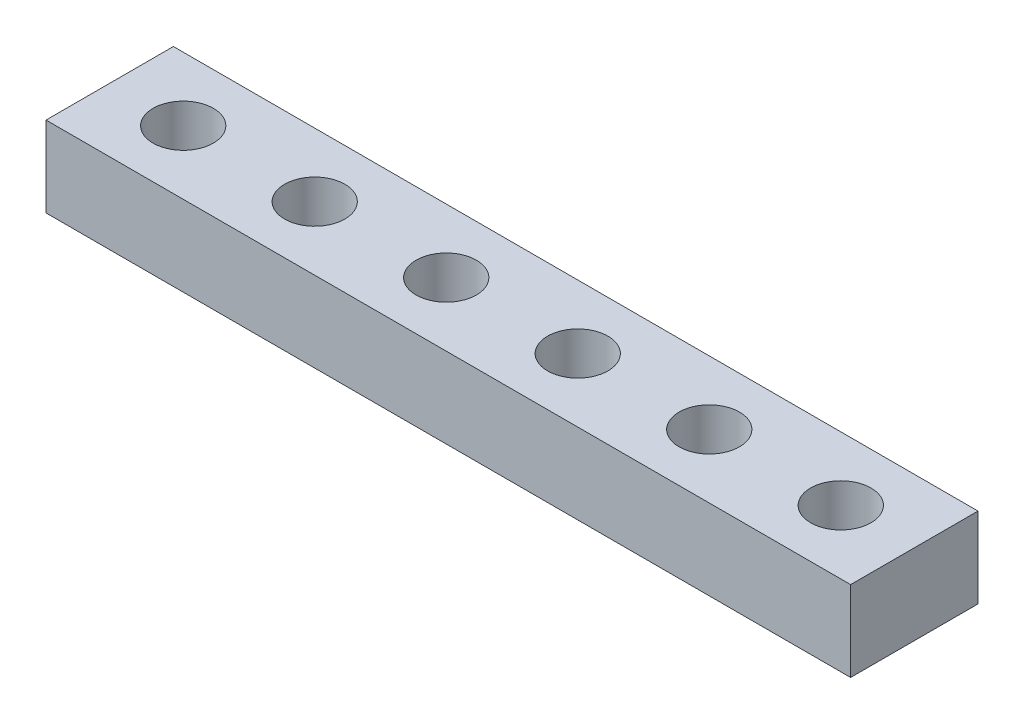
ISO-10303-21;
HEADER;
FILE_DESCRIPTION(('STEP AP214'),'2;1');
FILE_NAME('part.step','',(''),(''),'','','');
FILE_SCHEMA(('AUTOMOTIVE_DESIGN { 1 0 10303 214 1 1 1 1 }'));
ENDSEC;
DATA;
#1=APPLICATION_CONTEXT('core data for automotive mechanical design processes');
#2=APPLICATION_PROTOCOL_DEFINITION('international standard','automotive_design',2000,#1);
#3=PRODUCT_CONTEXT('',#1,'mechanical');
#4=PRODUCT('Part','Part','',(#3));
#5=PRODUCT_RELATED_PRODUCT_CATEGORY('part','',(#4));
#6=PRODUCT_DEFINITION_FORMATION('','',#4);
#7=PRODUCT_DEFINITION_CONTEXT('part definition',#1,'design');
#8=PRODUCT_DEFINITION('design','',#6,#7);
#9=PRODUCT_DEFINITION_SHAPE('','',#8);
#10=(LENGTH_UNIT() NAMED_UNIT(*) SI_UNIT(.MILLI.,.METRE.));
#11=(NAMED_UNIT(*) PLANE_ANGLE_UNIT() SI_UNIT($,.RADIAN.));
#12=(NAMED_UNIT(*) SI_UNIT($,.STERADIAN.) SOLID_ANGLE_UNIT());
#13=UNCERTAINTY_MEASURE_WITH_UNIT(LENGTH_MEASURE(1.E-05),#10,'distance_accuracy_value','');
#14=(GEOMETRIC_REPRESENTATION_CONTEXT(3) GLOBAL_UNCERTAINTY_ASSIGNED_CONTEXT((#13)) GLOBAL_UNIT_ASSIGNED_CONTEXT((#10,
#11,#12)) REPRESENTATION_CONTEXT('',''));
#15=CARTESIAN_POINT('',(0.,0.,0.));
#16=DIRECTION('',(0.,0.,1.));
#17=DIRECTION('',(1.,0.,0.));
#18=AXIS2_PLACEMENT_3D('',#15,#16,#17);
#19=CARTESIAN_POINT('',(0.,3.,0.));
#20=DIRECTION('',(0.,1.,0.));
#21=DIRECTION('',(0.,0.,1.));
#22=AXIS2_PLACEMENT_3D('',#19,#20,#21);
#23=PLANE('',#22);
#24=CARTESIAN_POINT('',(22.3554791776136,3.,2.375));
#25=DIRECTION('',(0.,1.,0.));
#26=DIRECTION('',(0.,0.,1.));
#27=AXIS2_PLACEMENT_3D('',#24,#25,#26);
#28=CIRCLE('',#27,1.125);
#29=CARTESIAN_POINT('',(22.3554791776136,3.,3.5));
#30=VERTEX_POINT('',#29);
#31=EDGE_CURVE('E158',#30,#30,#28,.T.);
#32=ORIENTED_EDGE('',*,*,#31,.F.);
#33=EDGE_LOOP('',(#32));
#34=FACE_BOUND('',#33,.T.);
#35=CARTESIAN_POINT('',(12.5481736074621,3.,2.37499999999999));
#36=DIRECTION('',(0.,1.,0.));
#37=DIRECTION('',(0.,0.,1.));
#38=AXIS2_PLACEMENT_3D('',#35,#36,#37);
#39=CIRCLE('',#38,1.125);
#40=CARTESIAN_POINT('',(12.5481736074621,3.,3.49999999999999));
#41=VERTEX_POINT('',#40);
#42=EDGE_CURVE('E142',#41,#41,#39,.T.);
#43=ORIENTED_EDGE('',*,*,#42,.F.);
#44=EDGE_LOOP('',(#43));
#45=FACE_BOUND('',#44,.T.);
#46=CARTESIAN_POINT('',(2.74086803731067,3.,2.375));
#47=DIRECTION('',(0.,1.,0.));
#48=DIRECTION('',(0.,0.,1.));
#49=AXIS2_PLACEMENT_3D('',#46,#47,#48);
#50=CIRCLE('',#49,1.125);
#51=CARTESIAN_POINT('',(2.74086803731067,3.,3.5));
#52=VERTEX_POINT('',#51);
#53=EDGE_CURVE('E112',#52,#52,#50,.T.);
#54=ORIENTED_EDGE('',*,*,#53,.F.);
#55=EDGE_LOOP('',(#54));
#56=FACE_BOUND('',#55,.T.);
#57=DIRECTION('',(0.,0.,1.));
#58=VECTOR('',#57,1.);
#59=CARTESIAN_POINT('',(0.,3.,0.));
#60=LINE('',#59,#58);
#61=CARTESIAN_POINT('',(0.,3.,0.));
#62=VERTEX_POINT('',#61);
#63=CARTESIAN_POINT('',(0.,3.,4.75));
#64=VERTEX_POINT('',#63);
#65=EDGE_CURVE('E92',#62,#64,#60,.T.);
#66=ORIENTED_EDGE('',*,*,#65,.T.);
#67=DIRECTION('',(1.,0.,0.));
#68=VECTOR('',#67,1.);
#69=CARTESIAN_POINT('',(0.,3.,4.75));
#70=LINE('',#69,#68);
#71=CARTESIAN_POINT('',(30.,3.,4.75));
#72=VERTEX_POINT('',#71);
#73=EDGE_CURVE('E87',#64,#72,#70,.T.);
#74=ORIENTED_EDGE('',*,*,#73,.T.);
#75=DIRECTION('',(0.,0.,-1.));
#76=VECTOR('',#75,1.);
#77=CARTESIAN_POINT('',(30.,3.,0.));
#78=LINE('',#77,#76);
#79=CARTESIAN_POINT('',(30.,3.,0.));
#80=VERTEX_POINT('',#79);
#81=EDGE_CURVE('E90',#72,#80,#78,.T.);
#82=ORIENTED_EDGE('',*,*,#81,.T.);
#83=DIRECTION('',(-1.,0.,0.));
#84=VECTOR('',#83,1.);
#85=CARTESIAN_POINT('',(0.,3.,0.));
#86=LINE('',#85,#84);
#87=EDGE_CURVE('E57',#80,#62,#86,.T.);
#88=ORIENTED_EDGE('',*,*,#87,.T.);
#89=EDGE_LOOP('',(#66,#74,#82,#88));
#90=FACE_BOUND('',#89,.T.);
#91=CARTESIAN_POINT('',(7.6445208223864,3.,2.375));
#92=DIRECTION('',(0.,1.,0.));
#93=DIRECTION('',(0.,0.,1.));
#94=AXIS2_PLACEMENT_3D('',#91,#92,#93);
#95=CIRCLE('',#94,1.125);
#96=CARTESIAN_POINT('',(7.6445208223864,3.,3.5));
#97=VERTEX_POINT('',#96);
#98=EDGE_CURVE('E134',#97,#97,#95,.T.);
#99=ORIENTED_EDGE('',*,*,#98,.F.);
#100=EDGE_LOOP('',(#99));
#101=FACE_BOUND('',#100,.T.);
#102=CARTESIAN_POINT('',(17.4518263925379,3.,2.37499999999999));
#103=DIRECTION('',(0.,1.,0.));
#104=DIRECTION('',(0.,0.,1.));
#105=AXIS2_PLACEMENT_3D('',#102,#103,#104);
#106=CIRCLE('',#105,1.125);
#107=CARTESIAN_POINT('',(17.4518263925379,3.,3.49999999999999));
#108=VERTEX_POINT('',#107);
#109=EDGE_CURVE('E150',#108,#108,#106,.T.);
#110=ORIENTED_EDGE('',*,*,#109,.F.);
#111=EDGE_LOOP('',(#110));
#112=FACE_BOUND('',#111,.T.);
#113=CARTESIAN_POINT('',(27.2591319626893,3.,2.375));
#114=DIRECTION('',(0.,1.,0.));
#115=DIRECTION('',(0.,0.,1.));
#116=AXIS2_PLACEMENT_3D('',#113,#114,#115);
#117=CIRCLE('',#116,1.125);
#118=CARTESIAN_POINT('',(27.2591319626893,3.,3.5));
#119=VERTEX_POINT('',#118);
#120=EDGE_CURVE('E166',#119,#119,#117,.T.);
#121=ORIENTED_EDGE('',*,*,#120,.F.);
#122=EDGE_LOOP('',(#121));
#123=FACE_BOUND('',#122,.T.);
#124=ADVANCED_FACE('F39',(#34,#45,#56,#90,#101,#112,#123),#23,.T.);
#125=CARTESIAN_POINT('',(0.,0.,0.));
#126=DIRECTION('',(0.,1.,0.));
#127=DIRECTION('',(0.,0.,1.));
#128=AXIS2_PLACEMENT_3D('',#125,#126,#127);
#129=PLANE('',#128);
#130=DIRECTION('',(0.,0.,1.));
#131=VECTOR('',#130,1.);
#132=CARTESIAN_POINT('',(0.,0.,0.));
#133=LINE('',#132,#131);
#134=CARTESIAN_POINT('',(0.,0.,0.));
#135=VERTEX_POINT('',#134);
#136=CARTESIAN_POINT('',(0.,0.,4.75));
#137=VERTEX_POINT('',#136);
#138=EDGE_CURVE('E108',#135,#137,#133,.T.);
#139=ORIENTED_EDGE('',*,*,#138,.F.);
#140=DIRECTION('',(-1.,0.,0.));
#141=VECTOR('',#140,1.);
#142=CARTESIAN_POINT('',(0.,0.,0.));
#143=LINE('',#142,#141);
#144=CARTESIAN_POINT('',(30.,0.,0.));
#145=VERTEX_POINT('',#144);
#146=EDGE_CURVE('E80',#145,#135,#143,.T.);
#147=ORIENTED_EDGE('',*,*,#146,.F.);
#148=DIRECTION('',(0.,0.,-1.));
#149=VECTOR('',#148,1.);
#150=CARTESIAN_POINT('',(30.,0.,0.));
#151=LINE('',#150,#149);
#152=CARTESIAN_POINT('',(30.,0.,4.75));
#153=VERTEX_POINT('',#152);
#154=EDGE_CURVE('E74',#153,#145,#151,.T.);
#155=ORIENTED_EDGE('',*,*,#154,.F.);
#156=DIRECTION('',(1.,0.,0.));
#157=VECTOR('',#156,1.);
#158=CARTESIAN_POINT('',(0.,0.,4.75));
#159=LINE('',#158,#157);
#160=EDGE_CURVE('E97',#137,#153,#159,.T.);
#161=ORIENTED_EDGE('',*,*,#160,.F.);
#162=EDGE_LOOP('',(#139,#147,#155,#161));
#163=FACE_BOUND('',#162,.T.);
#164=CARTESIAN_POINT('',(2.74086803731067,0.,2.375));
#165=DIRECTION('',(0.,1.,0.));
#166=DIRECTION('',(0.,0.,1.));
#167=AXIS2_PLACEMENT_3D('',#164,#165,#166);
#168=CIRCLE('',#167,1.125);
#169=CARTESIAN_POINT('',(2.74086803731067,0.,3.5));
#170=VERTEX_POINT('',#169);
#171=EDGE_CURVE('E130',#170,#170,#168,.T.);
#172=ORIENTED_EDGE('',*,*,#171,.T.);
#173=EDGE_LOOP('',(#172));
#174=FACE_BOUND('',#173,.T.);
#175=CARTESIAN_POINT('',(7.6445208223864,0.,2.375));
#176=DIRECTION('',(0.,1.,0.));
#177=DIRECTION('',(0.,0.,1.));
#178=AXIS2_PLACEMENT_3D('',#175,#176,#177);
#179=CIRCLE('',#178,1.125);
#180=CARTESIAN_POINT('',(7.6445208223864,0.,3.5));
#181=VERTEX_POINT('',#180);
#182=EDGE_CURVE('E138',#181,#181,#179,.T.);
#183=ORIENTED_EDGE('',*,*,#182,.T.);
#184=EDGE_LOOP('',(#183));
#185=FACE_BOUND('',#184,.T.);
#186=CARTESIAN_POINT('',(12.5481736074621,0.,2.37499999999999));
#187=DIRECTION('',(0.,1.,0.));
#188=DIRECTION('',(0.,0.,1.));
#189=AXIS2_PLACEMENT_3D('',#186,#187,#188);
#190=CIRCLE('',#189,1.125);
#191=CARTESIAN_POINT('',(12.5481736074621,0.,3.49999999999999));
#192=VERTEX_POINT('',#191);
#193=EDGE_CURVE('E146',#192,#192,#190,.T.);
#194=ORIENTED_EDGE('',*,*,#193,.T.);
#195=EDGE_LOOP('',(#194));
#196=FACE_BOUND('',#195,.T.);
#197=CARTESIAN_POINT('',(17.4518263925379,0.,2.37499999999999));
#198=DIRECTION('',(0.,1.,0.));
#199=DIRECTION('',(0.,0.,1.));
#200=AXIS2_PLACEMENT_3D('',#197,#198,#199);
#201=CIRCLE('',#200,1.125);
#202=CARTESIAN_POINT('',(17.4518263925379,0.,3.49999999999999));
#203=VERTEX_POINT('',#202);
#204=EDGE_CURVE('E154',#203,#203,#201,.T.);
#205=ORIENTED_EDGE('',*,*,#204,.T.);
#206=EDGE_LOOP('',(#205));
#207=FACE_BOUND('',#206,.T.);
#208=CARTESIAN_POINT('',(22.3554791776136,0.,2.375));
#209=DIRECTION('',(0.,1.,0.));
#210=DIRECTION('',(0.,0.,1.));
#211=AXIS2_PLACEMENT_3D('',#208,#209,#210);
#212=CIRCLE('',#211,1.125);
#213=CARTESIAN_POINT('',(22.3554791776136,0.,3.5));
#214=VERTEX_POINT('',#213);
#215=EDGE_CURVE('E162',#214,#214,#212,.T.);
#216=ORIENTED_EDGE('',*,*,#215,.T.);
#217=EDGE_LOOP('',(#216));
#218=FACE_BOUND('',#217,.T.);
#219=CARTESIAN_POINT('',(27.2591319626893,0.,2.375));
#220=DIRECTION('',(0.,1.,0.));
#221=DIRECTION('',(0.,0.,1.));
#222=AXIS2_PLACEMENT_3D('',#219,#220,#221);
#223=CIRCLE('',#222,1.125);
#224=CARTESIAN_POINT('',(27.2591319626893,0.,3.5));
#225=VERTEX_POINT('',#224);
#226=EDGE_CURVE('E170',#225,#225,#223,.T.);
#227=ORIENTED_EDGE('',*,*,#226,.T.);
#228=EDGE_LOOP('',(#227));
#229=FACE_BOUND('',#228,.T.);
#230=ADVANCED_FACE('F125',(#163,#174,#185,#196,#207,#218,#229),#129,.F.);
#231=CARTESIAN_POINT('',(0.,3.,0.));
#232=DIRECTION('',(1.,0.,0.));
#233=DIRECTION('',(0.,0.,-1.));
#234=AXIS2_PLACEMENT_3D('',#231,#232,#233);
#235=PLANE('',#234);
#236=ORIENTED_EDGE('',*,*,#138,.T.);
#237=DIRECTION('',(0.,-1.,0.));
#238=VECTOR('',#237,1.);
#239=CARTESIAN_POINT('',(0.,3.,4.75));
#240=LINE('',#239,#238);
#241=EDGE_CURVE('E11',#64,#137,#240,.T.);
#242=ORIENTED_EDGE('',*,*,#241,.F.);
#243=ORIENTED_EDGE('',*,*,#65,.F.);
#244=DIRECTION('',(0.,-1.,0.));
#245=VECTOR('',#244,1.);
#246=CARTESIAN_POINT('',(0.,3.,0.));
#247=LINE('',#246,#245);
#248=EDGE_CURVE('E104',#62,#135,#247,.T.);
#249=ORIENTED_EDGE('',*,*,#248,.T.);
#250=EDGE_LOOP('',(#236,#242,#243,#249));
#251=FACE_BOUND('',#250,.T.);
#252=ADVANCED_FACE('F41',(#251),#235,.F.);
#253=CARTESIAN_POINT('',(0.,3.,4.75));
#254=DIRECTION('',(0.,0.,-1.));
#255=DIRECTION('',(-1.,0.,0.));
#256=AXIS2_PLACEMENT_3D('',#253,#254,#255);
#257=PLANE('',#256);
#258=ORIENTED_EDGE('',*,*,#160,.T.);
#259=DIRECTION('',(0.,-1.,0.));
#260=VECTOR('',#259,1.);
#261=CARTESIAN_POINT('',(30.,3.,4.75));
#262=LINE('',#261,#260);
#263=EDGE_CURVE('E49',#72,#153,#262,.T.);
#264=ORIENTED_EDGE('',*,*,#263,.F.);
#265=ORIENTED_EDGE('',*,*,#73,.F.);
#266=ORIENTED_EDGE('',*,*,#241,.T.);
#267=EDGE_LOOP('',(#258,#264,#265,#266));
#268=FACE_BOUND('',#267,.T.);
#269=ADVANCED_FACE('F96',(#268),#257,.F.);
#270=CARTESIAN_POINT('',(30.,3.,0.));
#271=DIRECTION('',(-1.,0.,0.));
#272=DIRECTION('',(0.,0.,1.));
#273=AXIS2_PLACEMENT_3D('',#270,#271,#272);
#274=PLANE('',#273);
#275=ORIENTED_EDGE('',*,*,#154,.T.);
#276=DIRECTION('',(0.,-1.,0.));
#277=VECTOR('',#276,1.);
#278=CARTESIAN_POINT('',(30.,3.,0.));
#279=LINE('',#278,#277);
#280=EDGE_CURVE('E99',#80,#145,#279,.T.);
#281=ORIENTED_EDGE('',*,*,#280,.F.);
#282=ORIENTED_EDGE('',*,*,#81,.F.);
#283=ORIENTED_EDGE('',*,*,#263,.T.);
#284=EDGE_LOOP('',(#275,#281,#282,#283));
#285=FACE_BOUND('',#284,.T.);
#286=ADVANCED_FACE('F100',(#285),#274,.F.);
#287=CARTESIAN_POINT('',(0.,3.,0.));
#288=DIRECTION('',(0.,0.,1.));
#289=DIRECTION('',(1.,0.,0.));
#290=AXIS2_PLACEMENT_3D('',#287,#288,#289);
#291=PLANE('',#290);
#292=ORIENTED_EDGE('',*,*,#146,.T.);
#293=ORIENTED_EDGE('',*,*,#248,.F.);
#294=ORIENTED_EDGE('',*,*,#87,.F.);
#295=ORIENTED_EDGE('',*,*,#280,.T.);
#296=EDGE_LOOP('',(#292,#293,#294,#295));
#297=FACE_BOUND('',#296,.T.);
#298=ADVANCED_FACE('F122',(#297),#291,.F.);
#299=CARTESIAN_POINT('',(2.74086803731067,3.,2.375));
#300=DIRECTION('',(0.,-1.,0.));
#301=DIRECTION('',(0.,0.,-1.));
#302=AXIS2_PLACEMENT_3D('',#299,#300,#301);
#303=CYLINDRICAL_SURFACE('',#302,1.125);
#304=ORIENTED_EDGE('',*,*,#53,.T.);
#305=EDGE_LOOP('',(#304));
#306=FACE_BOUND('',#305,.T.);
#307=ORIENTED_EDGE('',*,*,#171,.F.);
#308=EDGE_LOOP('',(#307));
#309=FACE_BOUND('',#308,.T.);
#310=ADVANCED_FACE('F191',(#306,#309),#303,.F.);
#311=CARTESIAN_POINT('',(7.6445208223864,3.,2.375));
#312=DIRECTION('',(0.,-1.,0.));
#313=DIRECTION('',(0.,0.,-1.));
#314=AXIS2_PLACEMENT_3D('',#311,#312,#313);
#315=CYLINDRICAL_SURFACE('',#314,1.125);
#316=ORIENTED_EDGE('',*,*,#98,.T.);
#317=EDGE_LOOP('',(#316));
#318=FACE_BOUND('',#317,.T.);
#319=ORIENTED_EDGE('',*,*,#182,.F.);
#320=EDGE_LOOP('',(#319));
#321=FACE_BOUND('',#320,.T.);
#322=ADVANCED_FACE('F237',(#318,#321),#315,.F.);
#323=CARTESIAN_POINT('',(12.5481736074621,3.,2.37499999999999));
#324=DIRECTION('',(0.,-1.,0.));
#325=DIRECTION('',(0.,0.,-1.));
#326=AXIS2_PLACEMENT_3D('',#323,#324,#325);
#327=CYLINDRICAL_SURFACE('',#326,1.125);
#328=ORIENTED_EDGE('',*,*,#42,.T.);
#329=EDGE_LOOP('',(#328));
#330=FACE_BOUND('',#329,.T.);
#331=ORIENTED_EDGE('',*,*,#193,.F.);
#332=EDGE_LOOP('',(#331));
#333=FACE_BOUND('',#332,.T.);
#334=ADVANCED_FACE('F245',(#330,#333),#327,.F.);
#335=CARTESIAN_POINT('',(17.4518263925379,3.,2.37499999999999));
#336=DIRECTION('',(0.,-1.,0.));
#337=DIRECTION('',(0.,0.,-1.));
#338=AXIS2_PLACEMENT_3D('',#335,#336,#337);
#339=CYLINDRICAL_SURFACE('',#338,1.125);
#340=ORIENTED_EDGE('',*,*,#109,.T.);
#341=EDGE_LOOP('',(#340));
#342=FACE_BOUND('',#341,.T.);
#343=ORIENTED_EDGE('',*,*,#204,.F.);
#344=EDGE_LOOP('',(#343));
#345=FACE_BOUND('',#344,.T.);
#346=ADVANCED_FACE('F253',(#342,#345),#339,.F.);
#347=CARTESIAN_POINT('',(22.3554791776136,3.,2.375));
#348=DIRECTION('',(0.,-1.,0.));
#349=DIRECTION('',(0.,0.,-1.));
#350=AXIS2_PLACEMENT_3D('',#347,#348,#349);
#351=CYLINDRICAL_SURFACE('',#350,1.125);
#352=ORIENTED_EDGE('',*,*,#31,.T.);
#353=EDGE_LOOP('',(#352));
#354=FACE_BOUND('',#353,.T.);
#355=ORIENTED_EDGE('',*,*,#215,.F.);
#356=EDGE_LOOP('',(#355));
#357=FACE_BOUND('',#356,.T.);
#358=ADVANCED_FACE('F262',(#354,#357),#351,.F.);
#359=CARTESIAN_POINT('',(27.2591319626893,3.,2.375));
#360=DIRECTION('',(0.,-1.,0.));
#361=DIRECTION('',(0.,0.,-1.));
#362=AXIS2_PLACEMENT_3D('',#359,#360,#361);
#363=CYLINDRICAL_SURFACE('',#362,1.125);
#364=ORIENTED_EDGE('',*,*,#120,.T.);
#365=EDGE_LOOP('',(#364));
#366=FACE_BOUND('',#365,.T.);
#367=ORIENTED_EDGE('',*,*,#226,.F.);
#368=EDGE_LOOP('',(#367));
#369=FACE_BOUND('',#368,.T.);
#370=ADVANCED_FACE('F178',(#366,#369),#363,.F.);
#371=CLOSED_SHELL('',(#124,#230,#252,#269,#286,#298,#310,#322,#334,#346,#358,#370));
#372=MANIFOLD_SOLID_BREP('B2',#371);
#373=ADVANCED_BREP_SHAPE_REPRESENTATION('',(#18,#372),#14);
#374=SHAPE_DEFINITION_REPRESENTATION(#9,#373);
ENDSEC;
END-ISO-10303-21;
